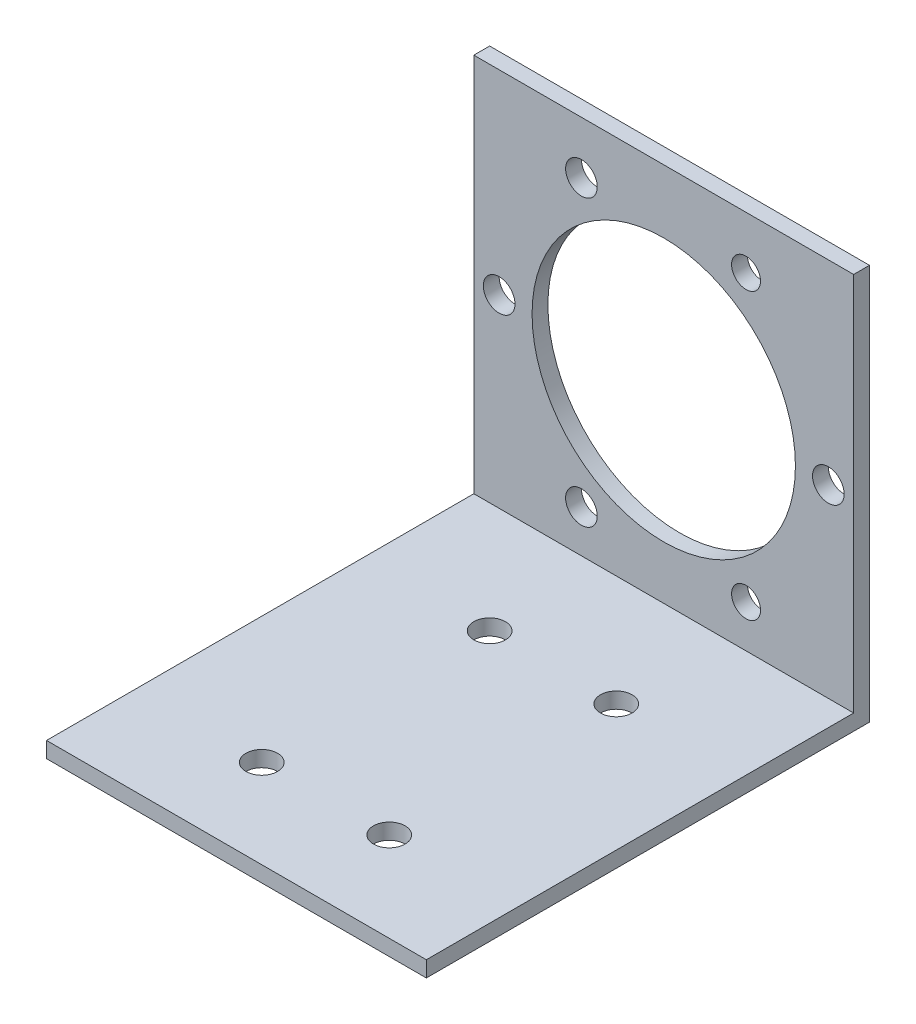
ISO-10303-21;
HEADER;
FILE_DESCRIPTION(('STEP AP214'),'2;1');
FILE_NAME('part.step','',(''),(''),'','','');
FILE_SCHEMA(('AUTOMOTIVE_DESIGN { 1 0 10303 214 1 1 1 1 }'));
ENDSEC;
DATA;
#1=APPLICATION_CONTEXT('core data for automotive mechanical design processes');
#2=APPLICATION_PROTOCOL_DEFINITION('international standard','automotive_design',2000,#1);
#3=PRODUCT_CONTEXT('',#1,'mechanical');
#4=PRODUCT('Part','Part','',(#3));
#5=PRODUCT_RELATED_PRODUCT_CATEGORY('part','',(#4));
#6=PRODUCT_DEFINITION_FORMATION('','',#4);
#7=PRODUCT_DEFINITION_CONTEXT('part definition',#1,'design');
#8=PRODUCT_DEFINITION('design','',#6,#7);
#9=PRODUCT_DEFINITION_SHAPE('','',#8);
#10=(LENGTH_UNIT() NAMED_UNIT(*) SI_UNIT(.MILLI.,.METRE.));
#11=(NAMED_UNIT(*) PLANE_ANGLE_UNIT() SI_UNIT($,.RADIAN.));
#12=(NAMED_UNIT(*) SI_UNIT($,.STERADIAN.) SOLID_ANGLE_UNIT());
#13=UNCERTAINTY_MEASURE_WITH_UNIT(LENGTH_MEASURE(1.E-05),#10,'distance_accuracy_value','');
#14=(GEOMETRIC_REPRESENTATION_CONTEXT(3) GLOBAL_UNCERTAINTY_ASSIGNED_CONTEXT((#13)) GLOBAL_UNIT_ASSIGNED_CONTEXT((#10,
#11,#12)) REPRESENTATION_CONTEXT('',''));
#15=CARTESIAN_POINT('',(0.,0.,0.));
#16=DIRECTION('',(0.,0.,1.));
#17=DIRECTION('',(1.,0.,0.));
#18=AXIS2_PLACEMENT_3D('',#15,#16,#17);
#19=CARTESIAN_POINT('',(0.,1.5875,44.45));
#20=DIRECTION('',(0.,-1.,0.));
#21=DIRECTION('',(0.,0.,-1.));
#22=AXIS2_PLACEMENT_3D('',#19,#20,#21);
#23=PLANE('',#22);
#24=CARTESIAN_POINT('',(25.4,1.5875,12.7));
#25=DIRECTION('',(0.,1.,0.));
#26=DIRECTION('',(0.,0.,1.));
#27=AXIS2_PLACEMENT_3D('',#24,#25,#26);
#28=CIRCLE('',#27,1.58749999999999);
#29=CARTESIAN_POINT('',(25.4,1.5875,14.2875));
#30=VERTEX_POINT('',#29);
#31=EDGE_CURVE('E302',#30,#30,#28,.T.);
#32=ORIENTED_EDGE('',*,*,#31,.F.);
#33=EDGE_LOOP('',(#32));
#34=FACE_BOUND('',#33,.T.);
#35=CARTESIAN_POINT('',(12.7,1.5875,12.7));
#36=DIRECTION('',(0.,1.,0.));
#37=DIRECTION('',(0.,0.,1.));
#38=AXIS2_PLACEMENT_3D('',#35,#36,#37);
#39=CIRCLE('',#38,1.58749999999999);
#40=CARTESIAN_POINT('',(12.7,1.5875,14.2875));
#41=VERTEX_POINT('',#40);
#42=EDGE_CURVE('E309',#41,#41,#39,.T.);
#43=ORIENTED_EDGE('',*,*,#42,.F.);
#44=EDGE_LOOP('',(#43));
#45=FACE_BOUND('',#44,.T.);
#46=CARTESIAN_POINT('',(12.7,1.5875,35.56));
#47=DIRECTION('',(0.,1.,0.));
#48=DIRECTION('',(0.,0.,1.));
#49=AXIS2_PLACEMENT_3D('',#46,#47,#48);
#50=CIRCLE('',#49,1.58749999999999);
#51=CARTESIAN_POINT('',(12.7,1.5875,37.1475));
#52=VERTEX_POINT('',#51);
#53=EDGE_CURVE('E317',#52,#52,#50,.T.);
#54=ORIENTED_EDGE('',*,*,#53,.F.);
#55=EDGE_LOOP('',(#54));
#56=FACE_BOUND('',#55,.T.);
#57=CARTESIAN_POINT('',(25.4,1.5875,35.4699303706849));
#58=DIRECTION('',(0.,1.,0.));
#59=DIRECTION('',(0.,0.,1.));
#60=AXIS2_PLACEMENT_3D('',#57,#58,#59);
#61=CIRCLE('',#60,1.58749999999999);
#62=CARTESIAN_POINT('',(25.4,1.5875,37.0574303706849));
#63=VERTEX_POINT('',#62);
#64=EDGE_CURVE('E325',#63,#63,#61,.T.);
#65=ORIENTED_EDGE('',*,*,#64,.F.);
#66=EDGE_LOOP('',(#65));
#67=FACE_BOUND('',#66,.T.);
#68=DIRECTION('',(1.,0.,0.));
#69=VECTOR('',#68,1.);
#70=CARTESIAN_POINT('',(0.,1.5875,1.5875));
#71=LINE('',#70,#69);
#72=CARTESIAN_POINT('',(0.,1.5875,1.5875));
#73=VERTEX_POINT('',#72);
#74=CARTESIAN_POINT('',(38.1,1.5875,1.5875));
#75=VERTEX_POINT('',#74);
#76=EDGE_CURVE('E57',#73,#75,#71,.T.);
#77=ORIENTED_EDGE('',*,*,#76,.F.);
#78=DIRECTION('',(0.,0.,-1.));
#79=VECTOR('',#78,1.);
#80=CARTESIAN_POINT('',(0.,1.5875,44.45));
#81=LINE('',#80,#79);
#82=CARTESIAN_POINT('',(0.,1.5875,44.45));
#83=VERTEX_POINT('',#82);
#84=EDGE_CURVE('E125',#83,#73,#81,.T.);
#85=ORIENTED_EDGE('',*,*,#84,.F.);
#86=DIRECTION('',(-1.,0.,0.));
#87=VECTOR('',#86,1.);
#88=CARTESIAN_POINT('',(0.,1.5875,44.45));
#89=LINE('',#88,#87);
#90=CARTESIAN_POINT('',(38.1,1.5875,44.45));
#91=VERTEX_POINT('',#90);
#92=EDGE_CURVE('E66',#91,#83,#89,.T.);
#93=ORIENTED_EDGE('',*,*,#92,.F.);
#94=DIRECTION('',(0.,0.,-1.));
#95=VECTOR('',#94,1.);
#96=CARTESIAN_POINT('',(38.1,1.5875,44.45));
#97=LINE('',#96,#95);
#98=EDGE_CURVE('E152',#91,#75,#97,.T.);
#99=ORIENTED_EDGE('',*,*,#98,.T.);
#100=EDGE_LOOP('',(#77,#85,#93,#99));
#101=FACE_BOUND('',#100,.T.);
#102=ADVANCED_FACE('F39',(#34,#45,#56,#67,#101),#23,.F.);
#103=CARTESIAN_POINT('',(0.,0.,44.45));
#104=DIRECTION('',(1.,0.,0.));
#105=DIRECTION('',(0.,0.,-1.));
#106=AXIS2_PLACEMENT_3D('',#103,#104,#105);
#107=PLANE('',#106);
#108=DIRECTION('',(0.,-1.,0.));
#109=VECTOR('',#108,1.);
#110=CARTESIAN_POINT('',(0.,0.,0.));
#111=LINE('',#110,#109);
#112=CARTESIAN_POINT('',(0.,39.6875,0.));
#113=VERTEX_POINT('',#112);
#114=CARTESIAN_POINT('',(0.,0.,0.));
#115=VERTEX_POINT('',#114);
#116=EDGE_CURVE('E127',#113,#115,#111,.T.);
#117=ORIENTED_EDGE('',*,*,#116,.T.);
#118=DIRECTION('',(0.,0.,-1.));
#119=VECTOR('',#118,1.);
#120=CARTESIAN_POINT('',(0.,0.,44.45));
#121=LINE('',#120,#119);
#122=CARTESIAN_POINT('',(0.,0.,44.45));
#123=VERTEX_POINT('',#122);
#124=EDGE_CURVE('E11',#123,#115,#121,.T.);
#125=ORIENTED_EDGE('',*,*,#124,.F.);
#126=DIRECTION('',(0.,-1.,0.));
#127=VECTOR('',#126,1.);
#128=CARTESIAN_POINT('',(0.,0.,44.45));
#129=LINE('',#128,#127);
#130=EDGE_CURVE('E135',#83,#123,#129,.T.);
#131=ORIENTED_EDGE('',*,*,#130,.F.);
#132=ORIENTED_EDGE('',*,*,#84,.T.);
#133=DIRECTION('',(0.,-1.,0.));
#134=VECTOR('',#133,1.);
#135=CARTESIAN_POINT('',(0.,39.6875,1.5875));
#136=LINE('',#135,#134);
#137=CARTESIAN_POINT('',(0.,39.6875,1.5875));
#138=VERTEX_POINT('',#137);
#139=EDGE_CURVE('E105',#138,#73,#136,.T.);
#140=ORIENTED_EDGE('',*,*,#139,.F.);
#141=DIRECTION('',(0.,0.,1.));
#142=VECTOR('',#141,1.);
#143=CARTESIAN_POINT('',(0.,39.6875,0.));
#144=LINE('',#143,#142);
#145=EDGE_CURVE('E113',#113,#138,#144,.T.);
#146=ORIENTED_EDGE('',*,*,#145,.F.);
#147=EDGE_LOOP('',(#117,#125,#131,#132,#140,#146));
#148=FACE_BOUND('',#147,.T.);
#149=ADVANCED_FACE('F41',(#148),#107,.F.);
#150=CARTESIAN_POINT('',(0.,0.,44.45));
#151=DIRECTION('',(0.,1.,0.));
#152=DIRECTION('',(0.,0.,1.));
#153=AXIS2_PLACEMENT_3D('',#150,#151,#152);
#154=PLANE('',#153);
#155=CARTESIAN_POINT('',(25.4,0.,12.7));
#156=DIRECTION('',(0.,1.,0.));
#157=DIRECTION('',(0.,0.,1.));
#158=AXIS2_PLACEMENT_3D('',#155,#156,#157);
#159=CIRCLE('',#158,1.5875);
#160=CARTESIAN_POINT('',(25.4,0.,14.2875));
#161=VERTEX_POINT('',#160);
#162=EDGE_CURVE('E306',#161,#161,#159,.T.);
#163=ORIENTED_EDGE('',*,*,#162,.T.);
#164=EDGE_LOOP('',(#163));
#165=FACE_BOUND('',#164,.T.);
#166=CARTESIAN_POINT('',(12.7,0.,12.7));
#167=DIRECTION('',(0.,1.,0.));
#168=DIRECTION('',(0.,0.,1.));
#169=AXIS2_PLACEMENT_3D('',#166,#167,#168);
#170=CIRCLE('',#169,1.5875);
#171=CARTESIAN_POINT('',(12.7,0.,14.2875));
#172=VERTEX_POINT('',#171);
#173=EDGE_CURVE('E313',#172,#172,#170,.T.);
#174=ORIENTED_EDGE('',*,*,#173,.T.);
#175=EDGE_LOOP('',(#174));
#176=FACE_BOUND('',#175,.T.);
#177=CARTESIAN_POINT('',(12.7,0.,35.56));
#178=DIRECTION('',(0.,1.,0.));
#179=DIRECTION('',(0.,0.,1.));
#180=AXIS2_PLACEMENT_3D('',#177,#178,#179);
#181=CIRCLE('',#180,1.5875);
#182=CARTESIAN_POINT('',(12.7,0.,37.1475));
#183=VERTEX_POINT('',#182);
#184=EDGE_CURVE('E321',#183,#183,#181,.T.);
#185=ORIENTED_EDGE('',*,*,#184,.T.);
#186=EDGE_LOOP('',(#185));
#187=FACE_BOUND('',#186,.T.);
#188=CARTESIAN_POINT('',(25.4,0.,35.4699303706849));
#189=DIRECTION('',(0.,1.,0.));
#190=DIRECTION('',(0.,0.,1.));
#191=AXIS2_PLACEMENT_3D('',#188,#189,#190);
#192=CIRCLE('',#191,1.5875);
#193=CARTESIAN_POINT('',(25.4,0.,37.0574303706849));
#194=VERTEX_POINT('',#193);
#195=EDGE_CURVE('E328',#194,#194,#192,.T.);
#196=ORIENTED_EDGE('',*,*,#195,.T.);
#197=EDGE_LOOP('',(#196));
#198=FACE_BOUND('',#197,.T.);
#199=DIRECTION('',(1.,0.,0.));
#200=VECTOR('',#199,1.);
#201=CARTESIAN_POINT('',(0.,0.,0.));
#202=LINE('',#201,#200);
#203=CARTESIAN_POINT('',(38.1,0.,0.));
#204=VERTEX_POINT('',#203);
#205=EDGE_CURVE('E79',#115,#204,#202,.T.);
#206=ORIENTED_EDGE('',*,*,#205,.T.);
#207=DIRECTION('',(0.,0.,-1.));
#208=VECTOR('',#207,1.);
#209=CARTESIAN_POINT('',(38.1,0.,44.45));
#210=LINE('',#209,#208);
#211=CARTESIAN_POINT('',(38.1,0.,44.45));
#212=VERTEX_POINT('',#211);
#213=EDGE_CURVE('E49',#212,#204,#210,.T.);
#214=ORIENTED_EDGE('',*,*,#213,.F.);
#215=DIRECTION('',(1.,0.,0.));
#216=VECTOR('',#215,1.);
#217=CARTESIAN_POINT('',(0.,0.,44.45));
#218=LINE('',#217,#216);
#219=EDGE_CURVE('E84',#123,#212,#218,.T.);
#220=ORIENTED_EDGE('',*,*,#219,.F.);
#221=ORIENTED_EDGE('',*,*,#124,.T.);
#222=EDGE_LOOP('',(#206,#214,#220,#221));
#223=FACE_BOUND('',#222,.T.);
#224=ADVANCED_FACE('F209',(#165,#176,#187,#198,#223),#154,.F.);
#225=CARTESIAN_POINT('',(38.1,0.,44.45));
#226=DIRECTION('',(-1.,0.,0.));
#227=DIRECTION('',(0.,0.,1.));
#228=AXIS2_PLACEMENT_3D('',#225,#226,#227);
#229=PLANE('',#228);
#230=DIRECTION('',(0.,1.,0.));
#231=VECTOR('',#230,1.);
#232=CARTESIAN_POINT('',(38.1,0.,0.));
#233=LINE('',#232,#231);
#234=CARTESIAN_POINT('',(38.1,39.6875,0.));
#235=VERTEX_POINT('',#234);
#236=EDGE_CURVE('E138',#204,#235,#233,.T.);
#237=ORIENTED_EDGE('',*,*,#236,.T.);
#238=DIRECTION('',(0.,0.,-1.));
#239=VECTOR('',#238,1.);
#240=CARTESIAN_POINT('',(38.1,39.6875,0.));
#241=LINE('',#240,#239);
#242=CARTESIAN_POINT('',(38.1,39.6875,1.5875));
#243=VERTEX_POINT('',#242);
#244=EDGE_CURVE('E112',#243,#235,#241,.T.);
#245=ORIENTED_EDGE('',*,*,#244,.F.);
#246=DIRECTION('',(0.,-1.,0.));
#247=VECTOR('',#246,1.);
#248=CARTESIAN_POINT('',(38.1,39.6875,1.5875));
#249=LINE('',#248,#247);
#250=EDGE_CURVE('E107',#243,#75,#249,.T.);
#251=ORIENTED_EDGE('',*,*,#250,.T.);
#252=ORIENTED_EDGE('',*,*,#98,.F.);
#253=DIRECTION('',(0.,1.,0.));
#254=VECTOR('',#253,1.);
#255=CARTESIAN_POINT('',(38.1,0.,44.45));
#256=LINE('',#255,#254);
#257=EDGE_CURVE('E141',#212,#91,#256,.T.);
#258=ORIENTED_EDGE('',*,*,#257,.F.);
#259=ORIENTED_EDGE('',*,*,#213,.T.);
#260=EDGE_LOOP('',(#237,#245,#251,#252,#258,#259));
#261=FACE_BOUND('',#260,.T.);
#262=ADVANCED_FACE('F203',(#261),#229,.F.);
#263=CARTESIAN_POINT('',(0.,0.,44.45));
#264=DIRECTION('',(0.,0.,-1.));
#265=DIRECTION('',(-1.,0.,0.));
#266=AXIS2_PLACEMENT_3D('',#263,#264,#265);
#267=PLANE('',#266);
#268=ORIENTED_EDGE('',*,*,#130,.T.);
#269=ORIENTED_EDGE('',*,*,#219,.T.);
#270=ORIENTED_EDGE('',*,*,#257,.T.);
#271=ORIENTED_EDGE('',*,*,#92,.T.);
#272=EDGE_LOOP('',(#268,#269,#270,#271));
#273=FACE_BOUND('',#272,.T.);
#274=ADVANCED_FACE('F216',(#273),#267,.F.);
#275=CARTESIAN_POINT('',(0.,0.,0.));
#276=DIRECTION('',(0.,0.,-1.));
#277=DIRECTION('',(-1.,0.,0.));
#278=AXIS2_PLACEMENT_3D('',#275,#276,#277);
#279=PLANE('',#278);
#280=CARTESIAN_POINT('',(27.3050000000001,5.83142058351895,0.));
#281=DIRECTION('',(0.,0.,-1.));
#282=DIRECTION('',(-1.,0.,0.));
#283=AXIS2_PLACEMENT_3D('',#280,#281,#282);
#284=CIRCLE('',#283,1.44999999999999);
#285=CARTESIAN_POINT('',(25.8550000000001,5.83142058351895,0.));
#286=VERTEX_POINT('',#285);
#287=EDGE_CURVE('E285',#286,#286,#284,.T.);
#288=ORIENTED_EDGE('',*,*,#287,.F.);
#289=EDGE_LOOP('',(#288));
#290=FACE_BOUND('',#289,.T.);
#291=CARTESIAN_POINT('',(27.3050000000001,34.427579416481,0.));
#292=DIRECTION('',(0.,0.,-1.));
#293=DIRECTION('',(-1.,0.,0.));
#294=AXIS2_PLACEMENT_3D('',#291,#292,#293);
#295=CIRCLE('',#294,1.44999999999999);
#296=CARTESIAN_POINT('',(25.8550000000001,34.427579416481,0.));
#297=VERTEX_POINT('',#296);
#298=EDGE_CURVE('E290',#297,#297,#295,.T.);
#299=ORIENTED_EDGE('',*,*,#298,.F.);
#300=EDGE_LOOP('',(#299));
#301=FACE_BOUND('',#300,.T.);
#302=CARTESIAN_POINT('',(35.56,20.1295,0.));
#303=DIRECTION('',(0.,0.,-1.));
#304=DIRECTION('',(-1.,0.,0.));
#305=AXIS2_PLACEMENT_3D('',#302,#303,#304);
#306=CIRCLE('',#305,1.5875);
#307=CARTESIAN_POINT('',(33.9725,20.1295,0.));
#308=VERTEX_POINT('',#307);
#309=EDGE_CURVE('E187',#308,#308,#306,.T.);
#310=ORIENTED_EDGE('',*,*,#309,.F.);
#311=EDGE_LOOP('',(#310));
#312=FACE_BOUND('',#311,.T.);
#313=CARTESIAN_POINT('',(10.795,34.4275794164811,0.));
#314=DIRECTION('',(0.,0.,-1.));
#315=DIRECTION('',(-1.,0.,0.));
#316=AXIS2_PLACEMENT_3D('',#313,#314,#315);
#317=CIRCLE('',#316,1.5875);
#318=CARTESIAN_POINT('',(9.20750000000004,34.4275794164811,0.));
#319=VERTEX_POINT('',#318);
#320=EDGE_CURVE('E174',#319,#319,#317,.T.);
#321=ORIENTED_EDGE('',*,*,#320,.F.);
#322=EDGE_LOOP('',(#321));
#323=FACE_BOUND('',#322,.T.);
#324=CARTESIAN_POINT('',(2.54,20.1295,0.));
#325=DIRECTION('',(0.,0.,-1.));
#326=DIRECTION('',(-1.,0.,0.));
#327=AXIS2_PLACEMENT_3D('',#324,#325,#326);
#328=CIRCLE('',#327,1.5875);
#329=CARTESIAN_POINT('',(0.952500000000001,20.1295,0.));
#330=VERTEX_POINT('',#329);
#331=EDGE_CURVE('E170',#330,#330,#328,.T.);
#332=ORIENTED_EDGE('',*,*,#331,.F.);
#333=EDGE_LOOP('',(#332));
#334=FACE_BOUND('',#333,.T.);
#335=CARTESIAN_POINT('',(10.795,5.8314205835189,0.));
#336=DIRECTION('',(0.,0.,-1.));
#337=DIRECTION('',(-1.,0.,0.));
#338=AXIS2_PLACEMENT_3D('',#335,#336,#337);
#339=CIRCLE('',#338,1.5875);
#340=CARTESIAN_POINT('',(9.20750000000004,5.8314205835189,0.));
#341=VERTEX_POINT('',#340);
#342=EDGE_CURVE('E166',#341,#341,#339,.T.);
#343=ORIENTED_EDGE('',*,*,#342,.F.);
#344=EDGE_LOOP('',(#343));
#345=FACE_BOUND('',#344,.T.);
#346=CARTESIAN_POINT('',(19.05,20.1295,0.));
#347=DIRECTION('',(0.,0.,-1.));
#348=DIRECTION('',(-1.,0.,0.));
#349=AXIS2_PLACEMENT_3D('',#346,#347,#348);
#350=CIRCLE('',#349,13.208);
#351=CARTESIAN_POINT('',(5.842,20.1295,0.));
#352=VERTEX_POINT('',#351);
#353=EDGE_CURVE('E161',#352,#352,#350,.T.);
#354=ORIENTED_EDGE('',*,*,#353,.F.);
#355=EDGE_LOOP('',(#354));
#356=FACE_BOUND('',#355,.T.);
#357=ORIENTED_EDGE('',*,*,#116,.F.);
#358=DIRECTION('',(-1.,0.,0.));
#359=VECTOR('',#358,1.);
#360=CARTESIAN_POINT('',(0.,39.6875,0.));
#361=LINE('',#360,#359);
#362=EDGE_CURVE('E119',#235,#113,#361,.T.);
#363=ORIENTED_EDGE('',*,*,#362,.F.);
#364=ORIENTED_EDGE('',*,*,#236,.F.);
#365=ORIENTED_EDGE('',*,*,#205,.F.);
#366=EDGE_LOOP('',(#357,#363,#364,#365));
#367=FACE_BOUND('',#366,.T.);
#368=ADVANCED_FACE('F207',(#290,#301,#312,#323,#334,#345,#356,#367),#279,.T.);
#369=CARTESIAN_POINT('',(0.,39.6875,1.5875));
#370=DIRECTION('',(0.,0.,-1.));
#371=DIRECTION('',(-1.,0.,0.));
#372=AXIS2_PLACEMENT_3D('',#369,#370,#371);
#373=PLANE('',#372);
#374=CARTESIAN_POINT('',(27.3050000000001,5.83142058351895,1.5875));
#375=DIRECTION('',(0.,0.,-1.));
#376=DIRECTION('',(-1.,0.,0.));
#377=AXIS2_PLACEMENT_3D('',#374,#375,#376);
#378=CIRCLE('',#377,1.44999999999999);
#379=CARTESIAN_POINT('',(25.8550000000001,5.83142058351895,1.5875));
#380=VERTEX_POINT('',#379);
#381=EDGE_CURVE('E288',#380,#380,#378,.T.);
#382=ORIENTED_EDGE('',*,*,#381,.T.);
#383=EDGE_LOOP('',(#382));
#384=FACE_BOUND('',#383,.T.);
#385=CARTESIAN_POINT('',(27.3050000000001,34.427579416481,1.5875));
#386=DIRECTION('',(0.,0.,-1.));
#387=DIRECTION('',(-1.,0.,0.));
#388=AXIS2_PLACEMENT_3D('',#385,#386,#387);
#389=CIRCLE('',#388,1.44999999999999);
#390=CARTESIAN_POINT('',(25.8550000000001,34.427579416481,1.5875));
#391=VERTEX_POINT('',#390);
#392=EDGE_CURVE('E295',#391,#391,#389,.T.);
#393=ORIENTED_EDGE('',*,*,#392,.T.);
#394=EDGE_LOOP('',(#393));
#395=FACE_BOUND('',#394,.T.);
#396=CARTESIAN_POINT('',(35.56,20.1295,1.5875));
#397=DIRECTION('',(0.,0.,-1.));
#398=DIRECTION('',(-1.,0.,0.));
#399=AXIS2_PLACEMENT_3D('',#396,#397,#398);
#400=CIRCLE('',#399,1.58749999999999);
#401=CARTESIAN_POINT('',(33.9725,20.1295,1.5875));
#402=VERTEX_POINT('',#401);
#403=EDGE_CURVE('E43',#402,#402,#400,.T.);
#404=ORIENTED_EDGE('',*,*,#403,.T.);
#405=EDGE_LOOP('',(#404));
#406=FACE_BOUND('',#405,.T.);
#407=CARTESIAN_POINT('',(10.795,34.4275794164811,1.5875));
#408=DIRECTION('',(0.,0.,-1.));
#409=DIRECTION('',(-1.,0.,0.));
#410=AXIS2_PLACEMENT_3D('',#407,#408,#409);
#411=CIRCLE('',#410,1.58749999999999);
#412=CARTESIAN_POINT('',(9.20750000000005,34.4275794164811,1.5875));
#413=VERTEX_POINT('',#412);
#414=EDGE_CURVE('E171',#413,#413,#411,.T.);
#415=ORIENTED_EDGE('',*,*,#414,.T.);
#416=EDGE_LOOP('',(#415));
#417=FACE_BOUND('',#416,.T.);
#418=CARTESIAN_POINT('',(2.54,20.1295,1.5875));
#419=DIRECTION('',(0.,0.,-1.));
#420=DIRECTION('',(-1.,0.,0.));
#421=AXIS2_PLACEMENT_3D('',#418,#419,#420);
#422=CIRCLE('',#421,1.58749999999999);
#423=CARTESIAN_POINT('',(0.952500000000007,20.1295,1.5875));
#424=VERTEX_POINT('',#423);
#425=EDGE_CURVE('E167',#424,#424,#422,.T.);
#426=ORIENTED_EDGE('',*,*,#425,.T.);
#427=EDGE_LOOP('',(#426));
#428=FACE_BOUND('',#427,.T.);
#429=CARTESIAN_POINT('',(10.795,5.8314205835189,1.5875));
#430=DIRECTION('',(0.,0.,-1.));
#431=DIRECTION('',(-1.,0.,0.));
#432=AXIS2_PLACEMENT_3D('',#429,#430,#431);
#433=CIRCLE('',#432,1.58749999999999);
#434=CARTESIAN_POINT('',(9.20750000000004,5.8314205835189,1.5875));
#435=VERTEX_POINT('',#434);
#436=EDGE_CURVE('E162',#435,#435,#433,.T.);
#437=ORIENTED_EDGE('',*,*,#436,.T.);
#438=EDGE_LOOP('',(#437));
#439=FACE_BOUND('',#438,.T.);
#440=CARTESIAN_POINT('',(19.05,20.1295,1.5875));
#441=DIRECTION('',(0.,0.,-1.));
#442=DIRECTION('',(-1.,0.,0.));
#443=AXIS2_PLACEMENT_3D('',#440,#441,#442);
#444=CIRCLE('',#443,13.208);
#445=CARTESIAN_POINT('',(5.842,20.1295,1.5875));
#446=VERTEX_POINT('',#445);
#447=EDGE_CURVE('E157',#446,#446,#444,.T.);
#448=ORIENTED_EDGE('',*,*,#447,.T.);
#449=EDGE_LOOP('',(#448));
#450=FACE_BOUND('',#449,.T.);
#451=ORIENTED_EDGE('',*,*,#76,.T.);
#452=ORIENTED_EDGE('',*,*,#250,.F.);
#453=DIRECTION('',(1.,0.,0.));
#454=VECTOR('',#453,1.);
#455=CARTESIAN_POINT('',(0.,39.6875,1.5875));
#456=LINE('',#455,#454);
#457=EDGE_CURVE('E101',#138,#243,#456,.T.);
#458=ORIENTED_EDGE('',*,*,#457,.F.);
#459=ORIENTED_EDGE('',*,*,#139,.T.);
#460=EDGE_LOOP('',(#451,#452,#458,#459));
#461=FACE_BOUND('',#460,.T.);
#462=ADVANCED_FACE('F103',(#384,#395,#406,#417,#428,#439,#450,#461),#373,.F.);
#463=CARTESIAN_POINT('',(0.,39.6875,0.));
#464=DIRECTION('',(0.,1.,0.));
#465=DIRECTION('',(0.,0.,1.));
#466=AXIS2_PLACEMENT_3D('',#463,#464,#465);
#467=PLANE('',#466);
#468=ORIENTED_EDGE('',*,*,#145,.T.);
#469=ORIENTED_EDGE('',*,*,#457,.T.);
#470=ORIENTED_EDGE('',*,*,#244,.T.);
#471=ORIENTED_EDGE('',*,*,#362,.T.);
#472=EDGE_LOOP('',(#468,#469,#470,#471));
#473=FACE_BOUND('',#472,.T.);
#474=ADVANCED_FACE('F117',(#473),#467,.T.);
#475=CARTESIAN_POINT('',(19.05,20.1295,44.45));
#476=DIRECTION('',(0.,0.,-1.));
#477=DIRECTION('',(-1.,0.,0.));
#478=AXIS2_PLACEMENT_3D('',#475,#476,#477);
#479=CYLINDRICAL_SURFACE('',#478,13.208);
#480=ORIENTED_EDGE('',*,*,#353,.T.);
#481=EDGE_LOOP('',(#480));
#482=FACE_BOUND('',#481,.T.);
#483=ORIENTED_EDGE('',*,*,#447,.F.);
#484=EDGE_LOOP('',(#483));
#485=FACE_BOUND('',#484,.T.);
#486=ADVANCED_FACE('F238',(#482,#485),#479,.F.);
#487=CARTESIAN_POINT('',(10.795,5.8314205835189,0.));
#488=DIRECTION('',(0.,0.,-1.));
#489=DIRECTION('',(-1.,0.,0.));
#490=AXIS2_PLACEMENT_3D('',#487,#488,#489);
#491=CYLINDRICAL_SURFACE('',#490,1.58749999999999);
#492=ORIENTED_EDGE('',*,*,#342,.T.);
#493=EDGE_LOOP('',(#492));
#494=FACE_BOUND('',#493,.T.);
#495=ORIENTED_EDGE('',*,*,#436,.F.);
#496=EDGE_LOOP('',(#495));
#497=FACE_BOUND('',#496,.T.);
#498=ADVANCED_FACE('F241',(#494,#497),#491,.F.);
#499=CARTESIAN_POINT('',(2.54,20.1295,0.));
#500=DIRECTION('',(0.,0.,-1.));
#501=DIRECTION('',(-1.,0.,0.));
#502=AXIS2_PLACEMENT_3D('',#499,#500,#501);
#503=CYLINDRICAL_SURFACE('',#502,1.58749999999999);
#504=ORIENTED_EDGE('',*,*,#331,.T.);
#505=EDGE_LOOP('',(#504));
#506=FACE_BOUND('',#505,.T.);
#507=ORIENTED_EDGE('',*,*,#425,.F.);
#508=EDGE_LOOP('',(#507));
#509=FACE_BOUND('',#508,.T.);
#510=ADVANCED_FACE('F245',(#506,#509),#503,.F.);
#511=CARTESIAN_POINT('',(10.795,34.4275794164811,0.));
#512=DIRECTION('',(0.,0.,-1.));
#513=DIRECTION('',(-1.,0.,0.));
#514=AXIS2_PLACEMENT_3D('',#511,#512,#513);
#515=CYLINDRICAL_SURFACE('',#514,1.58749999999999);
#516=ORIENTED_EDGE('',*,*,#320,.T.);
#517=EDGE_LOOP('',(#516));
#518=FACE_BOUND('',#517,.T.);
#519=ORIENTED_EDGE('',*,*,#414,.F.);
#520=EDGE_LOOP('',(#519));
#521=FACE_BOUND('',#520,.T.);
#522=ADVANCED_FACE('F249',(#518,#521),#515,.F.);
#523=CARTESIAN_POINT('',(35.56,20.1295,0.));
#524=DIRECTION('',(0.,0.,-1.));
#525=DIRECTION('',(-1.,0.,0.));
#526=AXIS2_PLACEMENT_3D('',#523,#524,#525);
#527=CYLINDRICAL_SURFACE('',#526,1.58749999999999);
#528=ORIENTED_EDGE('',*,*,#309,.T.);
#529=EDGE_LOOP('',(#528));
#530=FACE_BOUND('',#529,.T.);
#531=ORIENTED_EDGE('',*,*,#403,.F.);
#532=EDGE_LOOP('',(#531));
#533=FACE_BOUND('',#532,.T.);
#534=ADVANCED_FACE('F253',(#530,#533),#527,.F.);
#535=CARTESIAN_POINT('',(25.4,1.5875,35.4699303706849));
#536=DIRECTION('',(0.,1.,0.));
#537=DIRECTION('',(0.,0.,1.));
#538=AXIS2_PLACEMENT_3D('',#535,#536,#537);
#539=CYLINDRICAL_SURFACE('',#538,1.58749999999999);
#540=ORIENTED_EDGE('',*,*,#195,.F.);
#541=EDGE_LOOP('',(#540));
#542=FACE_BOUND('',#541,.T.);
#543=ORIENTED_EDGE('',*,*,#64,.T.);
#544=EDGE_LOOP('',(#543));
#545=FACE_BOUND('',#544,.T.);
#546=ADVANCED_FACE('F256',(#542,#545),#539,.F.);
#547=CARTESIAN_POINT('',(12.7,1.5875,35.56));
#548=DIRECTION('',(0.,1.,0.));
#549=DIRECTION('',(0.,0.,1.));
#550=AXIS2_PLACEMENT_3D('',#547,#548,#549);
#551=CYLINDRICAL_SURFACE('',#550,1.58749999999999);
#552=ORIENTED_EDGE('',*,*,#184,.F.);
#553=EDGE_LOOP('',(#552));
#554=FACE_BOUND('',#553,.T.);
#555=ORIENTED_EDGE('',*,*,#53,.T.);
#556=EDGE_LOOP('',(#555));
#557=FACE_BOUND('',#556,.T.);
#558=ADVANCED_FACE('F260',(#554,#557),#551,.F.);
#559=CARTESIAN_POINT('',(12.7,1.5875,12.7));
#560=DIRECTION('',(0.,1.,0.));
#561=DIRECTION('',(0.,0.,1.));
#562=AXIS2_PLACEMENT_3D('',#559,#560,#561);
#563=CYLINDRICAL_SURFACE('',#562,1.58749999999999);
#564=ORIENTED_EDGE('',*,*,#173,.F.);
#565=EDGE_LOOP('',(#564));
#566=FACE_BOUND('',#565,.T.);
#567=ORIENTED_EDGE('',*,*,#42,.T.);
#568=EDGE_LOOP('',(#567));
#569=FACE_BOUND('',#568,.T.);
#570=ADVANCED_FACE('F264',(#566,#569),#563,.F.);
#571=CARTESIAN_POINT('',(25.4,1.5875,12.7));
#572=DIRECTION('',(0.,1.,0.));
#573=DIRECTION('',(0.,0.,1.));
#574=AXIS2_PLACEMENT_3D('',#571,#572,#573);
#575=CYLINDRICAL_SURFACE('',#574,1.58749999999999);
#576=ORIENTED_EDGE('',*,*,#162,.F.);
#577=EDGE_LOOP('',(#576));
#578=FACE_BOUND('',#577,.T.);
#579=ORIENTED_EDGE('',*,*,#31,.T.);
#580=EDGE_LOOP('',(#579));
#581=FACE_BOUND('',#580,.T.);
#582=ADVANCED_FACE('F268',(#578,#581),#575,.F.);
#583=CARTESIAN_POINT('',(27.3050000000001,34.427579416481,0.));
#584=DIRECTION('',(0.,0.,-1.));
#585=DIRECTION('',(-1.,0.,0.));
#586=AXIS2_PLACEMENT_3D('',#583,#584,#585);
#587=CYLINDRICAL_SURFACE('',#586,1.44999999999999);
#588=ORIENTED_EDGE('',*,*,#298,.T.);
#589=EDGE_LOOP('',(#588));
#590=FACE_BOUND('',#589,.T.);
#591=ORIENTED_EDGE('',*,*,#392,.F.);
#592=EDGE_LOOP('',(#591));
#593=FACE_BOUND('',#592,.T.);
#594=ADVANCED_FACE('F272',(#590,#593),#587,.F.);
#595=CARTESIAN_POINT('',(27.3050000000001,5.83142058351895,0.));
#596=DIRECTION('',(0.,0.,-1.));
#597=DIRECTION('',(-1.,0.,0.));
#598=AXIS2_PLACEMENT_3D('',#595,#596,#597);
#599=CYLINDRICAL_SURFACE('',#598,1.44999999999999);
#600=ORIENTED_EDGE('',*,*,#287,.T.);
#601=EDGE_LOOP('',(#600));
#602=FACE_BOUND('',#601,.T.);
#603=ORIENTED_EDGE('',*,*,#381,.F.);
#604=EDGE_LOOP('',(#603));
#605=FACE_BOUND('',#604,.T.);
#606=ADVANCED_FACE('F276',(#602,#605),#599,.F.);
#607=CLOSED_SHELL('',(#102,#149,#224,#262,#274,#368,#462,#474,#486,#498,#510,#522,#534,#546,
#558,#570,#582,#594,#606));
#608=MANIFOLD_SOLID_BREP('B2',#607);
#609=ADVANCED_BREP_SHAPE_REPRESENTATION('',(#18,#608),#14);
#610=SHAPE_DEFINITION_REPRESENTATION(#9,#609);
ENDSEC;
END-ISO-10303-21;
